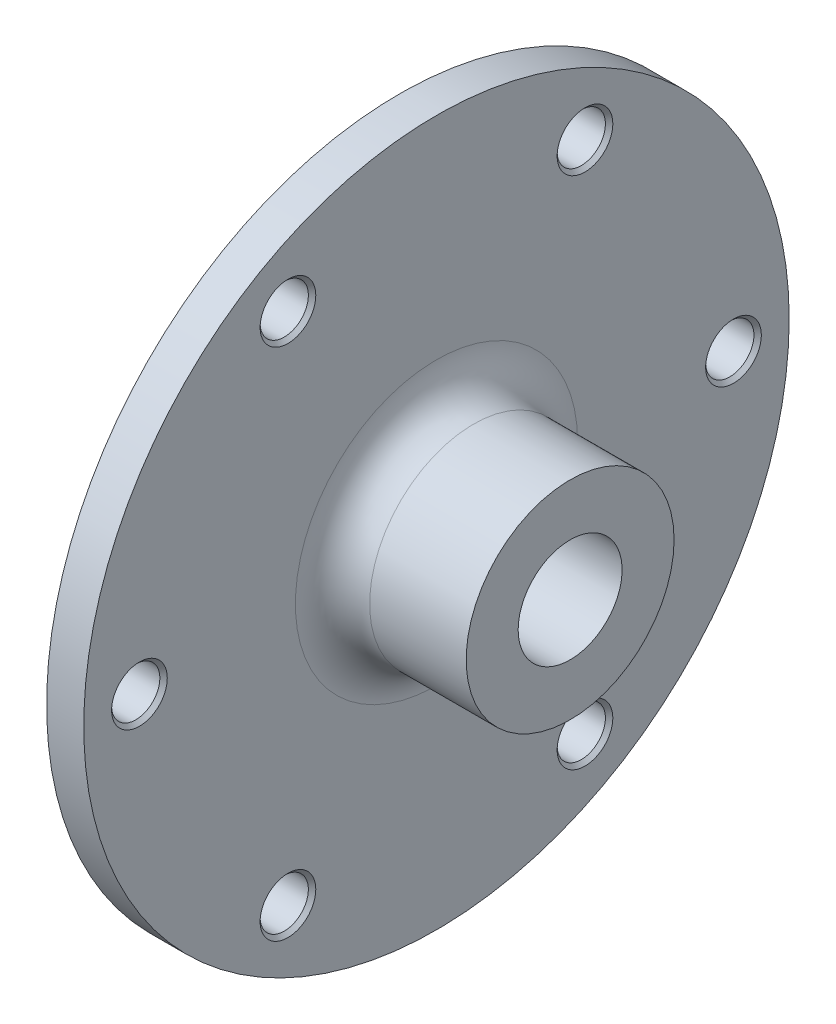
ISO-10303-21;
HEADER;
FILE_DESCRIPTION(('STEP AP214'),'2;1');
FILE_NAME('part.step','',(''),(''),'','','');
FILE_SCHEMA(('AUTOMOTIVE_DESIGN { 1 0 10303 214 1 1 1 1 }'));
ENDSEC;
DATA;
#1=APPLICATION_CONTEXT('core data for automotive mechanical design processes');
#2=APPLICATION_PROTOCOL_DEFINITION('international standard','automotive_design',2000,#1);
#3=PRODUCT_CONTEXT('',#1,'mechanical');
#4=PRODUCT('Part','Part','',(#3));
#5=PRODUCT_RELATED_PRODUCT_CATEGORY('part','',(#4));
#6=PRODUCT_DEFINITION_FORMATION('','',#4);
#7=PRODUCT_DEFINITION_CONTEXT('part definition',#1,'design');
#8=PRODUCT_DEFINITION('design','',#6,#7);
#9=PRODUCT_DEFINITION_SHAPE('','',#8);
#10=(LENGTH_UNIT() NAMED_UNIT(*) SI_UNIT(.MILLI.,.METRE.));
#11=(NAMED_UNIT(*) PLANE_ANGLE_UNIT() SI_UNIT($,.RADIAN.));
#12=(NAMED_UNIT(*) SI_UNIT($,.STERADIAN.) SOLID_ANGLE_UNIT());
#13=UNCERTAINTY_MEASURE_WITH_UNIT(LENGTH_MEASURE(1.E-05),#10,'distance_accuracy_value','');
#14=(GEOMETRIC_REPRESENTATION_CONTEXT(3) GLOBAL_UNCERTAINTY_ASSIGNED_CONTEXT((#13)) GLOBAL_UNIT_ASSIGNED_CONTEXT((#10,
#11,#12)) REPRESENTATION_CONTEXT('',''));
#15=CARTESIAN_POINT('',(0.,0.,0.));
#16=DIRECTION('',(0.,0.,1.));
#17=DIRECTION('',(1.,0.,0.));
#18=AXIS2_PLACEMENT_3D('',#15,#16,#17);
#19=CARTESIAN_POINT('',(0.,14.,0.));
#20=DIRECTION('',(1.,0.,0.));
#21=DIRECTION('',(0.,0.,-1.));
#22=AXIS2_PLACEMENT_3D('',#19,#20,#21);
#23=PLANE('',#22);
#24=CARTESIAN_POINT('',(0.,0.,0.));
#25=DIRECTION('',(-1.,0.,0.));
#26=DIRECTION('',(0.,0.,1.));
#27=AXIS2_PLACEMENT_3D('',#24,#25,#26);
#28=CIRCLE('',#27,6.99999999999999);
#29=CARTESIAN_POINT('',(0.,0.,6.99999999999999));
#30=VERTEX_POINT('',#29);
#31=EDGE_CURVE('E103',#30,#30,#28,.T.);
#32=ORIENTED_EDGE('',*,*,#31,.T.);
#33=EDGE_LOOP('',(#32));
#34=FACE_BOUND('',#33,.T.);
#35=CARTESIAN_POINT('',(0.,0.,0.));
#36=DIRECTION('',(1.,0.,0.));
#37=DIRECTION('',(0.,0.,-1.));
#38=AXIS2_PLACEMENT_3D('',#35,#36,#37);
#39=CIRCLE('',#38,14.);
#40=CARTESIAN_POINT('',(0.,0.,-14.));
#41=VERTEX_POINT('',#40);
#42=EDGE_CURVE('E106',#41,#41,#39,.T.);
#43=ORIENTED_EDGE('',*,*,#42,.T.);
#44=EDGE_LOOP('',(#43));
#45=FACE_BOUND('',#44,.T.);
#46=ADVANCED_FACE('F31',(#34,#45),#23,.T.);
#47=CARTESIAN_POINT('',(-28.,0.,0.));
#48=DIRECTION('',(-1.,0.,0.));
#49=DIRECTION('',(0.,0.,1.));
#50=AXIS2_PLACEMENT_3D('',#47,#48,#49);
#51=PLANE('',#50);
#52=CARTESIAN_POINT('',(-28.,0.,0.));
#53=DIRECTION('',(-1.,0.,0.));
#54=DIRECTION('',(0.,0.,1.));
#55=AXIS2_PLACEMENT_3D('',#52,#53,#54);
#56=CIRCLE('',#55,13.);
#57=CARTESIAN_POINT('',(-28.,0.,13.));
#58=VERTEX_POINT('',#57);
#59=EDGE_CURVE('E51',#58,#58,#56,.T.);
#60=ORIENTED_EDGE('',*,*,#59,.F.);
#61=EDGE_LOOP('',(#60));
#62=FACE_BOUND('',#61,.T.);
#63=CARTESIAN_POINT('',(-28.,0.,0.));
#64=DIRECTION('',(1.,0.,0.));
#65=DIRECTION('',(0.,0.,-1.));
#66=AXIS2_PLACEMENT_3D('',#63,#64,#65);
#67=CIRCLE('',#66,35.);
#68=CARTESIAN_POINT('',(-28.,0.,-35.));
#69=VERTEX_POINT('',#68);
#70=EDGE_CURVE('E44',#69,#69,#67,.T.);
#71=ORIENTED_EDGE('',*,*,#70,.F.);
#72=EDGE_LOOP('',(#71));
#73=FACE_BOUND('',#72,.T.);
#74=ADVANCED_FACE('F123',(#62,#73),#51,.T.);
#75=CARTESIAN_POINT('',(0.,0.,0.));
#76=DIRECTION('',(1.,0.,0.));
#77=DIRECTION('',(0.,0.,-1.));
#78=AXIS2_PLACEMENT_3D('',#75,#76,#77);
#79=CYLINDRICAL_SURFACE('',#78,35.);
#80=ORIENTED_EDGE('',*,*,#70,.T.);
#81=EDGE_LOOP('',(#80));
#82=FACE_BOUND('',#81,.T.);
#83=CARTESIAN_POINT('',(-23.,0.,0.));
#84=DIRECTION('',(1.,0.,0.));
#85=DIRECTION('',(0.,0.,-1.));
#86=AXIS2_PLACEMENT_3D('',#83,#84,#85);
#87=CIRCLE('',#86,35.);
#88=CARTESIAN_POINT('',(-23.,0.,-35.));
#89=VERTEX_POINT('',#88);
#90=EDGE_CURVE('E115',#89,#89,#87,.T.);
#91=ORIENTED_EDGE('',*,*,#90,.F.);
#92=EDGE_LOOP('',(#91));
#93=FACE_BOUND('',#92,.T.);
#94=ADVANCED_FACE('F120',(#82,#93),#79,.T.);
#95=CARTESIAN_POINT('',(-23.,35.,0.));
#96=DIRECTION('',(-1.,0.,0.));
#97=DIRECTION('',(0.,0.,1.));
#98=AXIS2_PLACEMENT_3D('',#95,#96,#97);
#99=PLANE('',#98);
#100=CARTESIAN_POINT('',(-23.,-34.6410161513773,20.0000000000004));
#101=DIRECTION('',(-1.,0.,0.));
#102=DIRECTION('',(0.,0.,1.));
#103=AXIS2_PLACEMENT_3D('',#100,#101,#102);
#104=CIRCLE('',#103,3.25);
#105=CARTESIAN_POINT('',(-23.,-34.6410161513773,23.2500000000004));
#106=VERTEX_POINT('',#105);
#107=EDGE_CURVE('E35',#106,#106,#104,.T.);
#108=ORIENTED_EDGE('',*,*,#107,.F.);
#109=EDGE_LOOP('',(#108));
#110=FACE_BOUND('',#109,.T.);
#111=CARTESIAN_POINT('',(-23.,-34.6410161513777,-19.9999999999997));
#112=DIRECTION('',(-1.,0.,0.));
#113=DIRECTION('',(0.,0.,1.));
#114=AXIS2_PLACEMENT_3D('',#111,#112,#113);
#115=CIRCLE('',#114,3.25);
#116=CARTESIAN_POINT('',(-23.,-34.6410161513777,-16.7499999999997));
#117=VERTEX_POINT('',#116);
#118=EDGE_CURVE('E67',#117,#117,#115,.T.);
#119=ORIENTED_EDGE('',*,*,#118,.F.);
#120=EDGE_LOOP('',(#119));
#121=FACE_BOUND('',#120,.T.);
#122=CARTESIAN_POINT('',(-23.,0.,-40.));
#123=DIRECTION('',(-1.,0.,0.));
#124=DIRECTION('',(0.,0.,1.));
#125=AXIS2_PLACEMENT_3D('',#122,#123,#124);
#126=CIRCLE('',#125,3.25);
#127=CARTESIAN_POINT('',(-23.,0.,-36.75));
#128=VERTEX_POINT('',#127);
#129=EDGE_CURVE('E63',#128,#128,#126,.T.);
#130=ORIENTED_EDGE('',*,*,#129,.F.);
#131=EDGE_LOOP('',(#130));
#132=FACE_BOUND('',#131,.T.);
#133=CARTESIAN_POINT('',(-23.,34.6410161513775,-20.0000000000002));
#134=DIRECTION('',(-1.,0.,0.));
#135=DIRECTION('',(0.,0.,1.));
#136=AXIS2_PLACEMENT_3D('',#133,#134,#135);
#137=CIRCLE('',#136,3.25);
#138=CARTESIAN_POINT('',(-23.,34.6410161513775,-16.7500000000002));
#139=VERTEX_POINT('',#138);
#140=EDGE_CURVE('E58',#139,#139,#137,.T.);
#141=ORIENTED_EDGE('',*,*,#140,.F.);
#142=EDGE_LOOP('',(#141));
#143=FACE_BOUND('',#142,.T.);
#144=CARTESIAN_POINT('',(-23.,34.6410161513776,19.9999999999999));
#145=DIRECTION('',(-1.,0.,0.));
#146=DIRECTION('',(0.,0.,1.));
#147=AXIS2_PLACEMENT_3D('',#144,#145,#146);
#148=CIRCLE('',#147,3.25);
#149=CARTESIAN_POINT('',(-23.,34.6410161513776,23.2499999999999));
#150=VERTEX_POINT('',#149);
#151=EDGE_CURVE('E53',#150,#150,#148,.T.);
#152=ORIENTED_EDGE('',*,*,#151,.F.);
#153=EDGE_LOOP('',(#152));
#154=FACE_BOUND('',#153,.T.);
#155=CARTESIAN_POINT('',(-23.,0.,40.));
#156=DIRECTION('',(-1.,0.,0.));
#157=DIRECTION('',(0.,0.,1.));
#158=AXIS2_PLACEMENT_3D('',#155,#156,#157);
#159=CIRCLE('',#158,3.25);
#160=CARTESIAN_POINT('',(-23.,0.,43.25));
#161=VERTEX_POINT('',#160);
#162=EDGE_CURVE('E48',#161,#161,#159,.T.);
#163=ORIENTED_EDGE('',*,*,#162,.F.);
#164=EDGE_LOOP('',(#163));
#165=FACE_BOUND('',#164,.T.);
#166=ORIENTED_EDGE('',*,*,#90,.T.);
#167=EDGE_LOOP('',(#166));
#168=FACE_BOUND('',#167,.T.);
#169=CARTESIAN_POINT('',(-23.,0.,0.));
#170=DIRECTION('',(1.,0.,0.));
#171=DIRECTION('',(0.,0.,-1.));
#172=AXIS2_PLACEMENT_3D('',#169,#170,#171);
#173=CIRCLE('',#172,47.5);
#174=CARTESIAN_POINT('',(-23.,0.,-47.5));
#175=VERTEX_POINT('',#174);
#176=EDGE_CURVE('E112',#175,#175,#173,.T.);
#177=ORIENTED_EDGE('',*,*,#176,.F.);
#178=EDGE_LOOP('',(#177));
#179=FACE_BOUND('',#178,.T.);
#180=ADVANCED_FACE('F131',(#110,#121,#132,#143,#154,#165,#168,#179),#99,.T.);
#181=CARTESIAN_POINT('',(0.,0.,0.));
#182=DIRECTION('',(1.,0.,0.));
#183=DIRECTION('',(0.,0.,-1.));
#184=AXIS2_PLACEMENT_3D('',#181,#182,#183);
#185=CYLINDRICAL_SURFACE('',#184,47.5);
#186=ORIENTED_EDGE('',*,*,#176,.T.);
#187=EDGE_LOOP('',(#186));
#188=FACE_BOUND('',#187,.T.);
#189=CARTESIAN_POINT('',(-18.,0.,0.));
#190=DIRECTION('',(1.,0.,0.));
#191=DIRECTION('',(0.,0.,-1.));
#192=AXIS2_PLACEMENT_3D('',#189,#190,#191);
#193=CIRCLE('',#192,47.5);
#194=CARTESIAN_POINT('',(-18.,0.,-47.5));
#195=VERTEX_POINT('',#194);
#196=EDGE_CURVE('E109',#195,#195,#193,.T.);
#197=ORIENTED_EDGE('',*,*,#196,.F.);
#198=EDGE_LOOP('',(#197));
#199=FACE_BOUND('',#198,.T.);
#200=ADVANCED_FACE('F138',(#188,#199),#185,.T.);
#201=CARTESIAN_POINT('',(-18.,47.5,0.));
#202=DIRECTION('',(1.,0.,0.));
#203=DIRECTION('',(0.,0.,-1.));
#204=AXIS2_PLACEMENT_3D('',#201,#202,#203);
#205=PLANE('',#204);
#206=CARTESIAN_POINT('',(-18.,-34.6410161513773,20.0000000000004));
#207=DIRECTION('',(1.,0.,0.));
#208=DIRECTION('',(0.,0.,-1.));
#209=AXIS2_PLACEMENT_3D('',#206,#207,#208);
#210=CIRCLE('',#209,3.75);
#211=CARTESIAN_POINT('',(-18.,-34.6410161513773,16.2500000000004));
#212=VERTEX_POINT('',#211);
#213=EDGE_CURVE('E213',#212,#212,#210,.T.);
#214=ORIENTED_EDGE('',*,*,#213,.F.);
#215=EDGE_LOOP('',(#214));
#216=FACE_BOUND('',#215,.T.);
#217=CARTESIAN_POINT('',(-18.,-34.6410161513777,-19.9999999999997));
#218=DIRECTION('',(1.,0.,0.));
#219=DIRECTION('',(0.,0.,-1.));
#220=AXIS2_PLACEMENT_3D('',#217,#218,#219);
#221=CIRCLE('',#220,3.75);
#222=CARTESIAN_POINT('',(-18.,-34.6410161513777,-23.7499999999997));
#223=VERTEX_POINT('',#222);
#224=EDGE_CURVE('E76',#223,#223,#221,.T.);
#225=ORIENTED_EDGE('',*,*,#224,.F.);
#226=EDGE_LOOP('',(#225));
#227=FACE_BOUND('',#226,.T.);
#228=CARTESIAN_POINT('',(-18.,0.,-40.));
#229=DIRECTION('',(1.,0.,0.));
#230=DIRECTION('',(0.,0.,-1.));
#231=AXIS2_PLACEMENT_3D('',#228,#229,#230);
#232=CIRCLE('',#231,3.75);
#233=CARTESIAN_POINT('',(-18.,0.,-43.75));
#234=VERTEX_POINT('',#233);
#235=EDGE_CURVE('E69',#234,#234,#232,.T.);
#236=ORIENTED_EDGE('',*,*,#235,.F.);
#237=EDGE_LOOP('',(#236));
#238=FACE_BOUND('',#237,.T.);
#239=CARTESIAN_POINT('',(-18.,34.6410161513775,-20.0000000000002));
#240=DIRECTION('',(1.,0.,0.));
#241=DIRECTION('',(0.,0.,-1.));
#242=AXIS2_PLACEMENT_3D('',#239,#240,#241);
#243=CIRCLE('',#242,3.75);
#244=CARTESIAN_POINT('',(-18.,34.6410161513775,-23.7500000000002));
#245=VERTEX_POINT('',#244);
#246=EDGE_CURVE('E65',#245,#245,#243,.T.);
#247=ORIENTED_EDGE('',*,*,#246,.F.);
#248=EDGE_LOOP('',(#247));
#249=FACE_BOUND('',#248,.T.);
#250=CARTESIAN_POINT('',(-18.,34.6410161513776,19.9999999999999));
#251=DIRECTION('',(1.,0.,0.));
#252=DIRECTION('',(0.,0.,-1.));
#253=AXIS2_PLACEMENT_3D('',#250,#251,#252);
#254=CIRCLE('',#253,3.75);
#255=CARTESIAN_POINT('',(-18.,34.6410161513776,16.2499999999999));
#256=VERTEX_POINT('',#255);
#257=EDGE_CURVE('E61',#256,#256,#254,.T.);
#258=ORIENTED_EDGE('',*,*,#257,.F.);
#259=EDGE_LOOP('',(#258));
#260=FACE_BOUND('',#259,.T.);
#261=CARTESIAN_POINT('',(-18.,0.,40.));
#262=DIRECTION('',(1.,0.,0.));
#263=DIRECTION('',(0.,0.,-1.));
#264=AXIS2_PLACEMENT_3D('',#261,#262,#263);
#265=CIRCLE('',#264,3.75);
#266=CARTESIAN_POINT('',(-18.,0.,36.25));
#267=VERTEX_POINT('',#266);
#268=EDGE_CURVE('E56',#267,#267,#265,.T.);
#269=ORIENTED_EDGE('',*,*,#268,.F.);
#270=EDGE_LOOP('',(#269));
#271=FACE_BOUND('',#270,.T.);
#272=CARTESIAN_POINT('',(-18.,0.,0.));
#273=DIRECTION('',(1.,0.,0.));
#274=DIRECTION('',(0.,0.,-1.));
#275=AXIS2_PLACEMENT_3D('',#272,#273,#274);
#276=CIRCLE('',#275,19.);
#277=CARTESIAN_POINT('',(-18.,0.,-19.));
#278=VERTEX_POINT('',#277);
#279=EDGE_CURVE('E10',#278,#278,#276,.F.);
#280=ORIENTED_EDGE('',*,*,#279,.T.);
#281=EDGE_LOOP('',(#280));
#282=FACE_BOUND('',#281,.T.);
#283=ORIENTED_EDGE('',*,*,#196,.T.);
#284=EDGE_LOOP('',(#283));
#285=FACE_BOUND('',#284,.T.);
#286=ADVANCED_FACE('F142',(#216,#227,#238,#249,#260,#271,#282,#285),#205,.T.);
#287=CARTESIAN_POINT('',(0.,0.,0.));
#288=DIRECTION('',(1.,0.,0.));
#289=DIRECTION('',(0.,0.,-1.));
#290=AXIS2_PLACEMENT_3D('',#287,#288,#289);
#291=CYLINDRICAL_SURFACE('',#290,14.);
#292=CARTESIAN_POINT('',(-13.,0.,0.));
#293=DIRECTION('',(1.,0.,0.));
#294=DIRECTION('',(0.,0.,-1.));
#295=AXIS2_PLACEMENT_3D('',#292,#293,#294);
#296=CIRCLE('',#295,14.);
#297=CARTESIAN_POINT('',(-13.,0.,-14.));
#298=VERTEX_POINT('',#297);
#299=EDGE_CURVE('E39',#298,#298,#296,.T.);
#300=ORIENTED_EDGE('',*,*,#299,.T.);
#301=EDGE_LOOP('',(#300));
#302=FACE_BOUND('',#301,.T.);
#303=ORIENTED_EDGE('',*,*,#42,.F.);
#304=EDGE_LOOP('',(#303));
#305=FACE_BOUND('',#304,.T.);
#306=ADVANCED_FACE('F146',(#302,#305),#291,.T.);
#307=CARTESIAN_POINT('',(-13.,0.,0.));
#308=DIRECTION('',(1.,0.,0.));
#309=DIRECTION('',(0.,0.,-1.));
#310=AXIS2_PLACEMENT_3D('',#307,#308,#309);
#311=TOROIDAL_SURFACE('',#310,19.,5.);
#312=ORIENTED_EDGE('',*,*,#279,.F.);
#313=EDGE_LOOP('',(#312));
#314=FACE_BOUND('',#313,.T.);
#315=ORIENTED_EDGE('',*,*,#299,.F.);
#316=EDGE_LOOP('',(#315));
#317=FACE_BOUND('',#316,.T.);
#318=ADVANCED_FACE('F33',(#314,#317),#311,.F.);
#319=CARTESIAN_POINT('',(-28.,0.,0.));
#320=DIRECTION('',(-1.,0.,0.));
#321=DIRECTION('',(0.,0.,1.));
#322=AXIS2_PLACEMENT_3D('',#319,#320,#321);
#323=CYLINDRICAL_SURFACE('',#322,6.99999999999999);
#324=ORIENTED_EDGE('',*,*,#31,.F.);
#325=EDGE_LOOP('',(#324));
#326=FACE_BOUND('',#325,.T.);
#327=CARTESIAN_POINT('',(-22.,0.,0.));
#328=DIRECTION('',(-1.,0.,0.));
#329=DIRECTION('',(0.,0.,1.));
#330=AXIS2_PLACEMENT_3D('',#327,#328,#329);
#331=CIRCLE('',#330,7.);
#332=CARTESIAN_POINT('',(-22.,0.,7.));
#333=VERTEX_POINT('',#332);
#334=EDGE_CURVE('E100',#333,#333,#331,.T.);
#335=ORIENTED_EDGE('',*,*,#334,.T.);
#336=EDGE_LOOP('',(#335));
#337=FACE_BOUND('',#336,.T.);
#338=ADVANCED_FACE('F151',(#326,#337),#323,.F.);
#339=CARTESIAN_POINT('',(-28.,0.,0.));
#340=DIRECTION('',(-1.,0.,0.));
#341=DIRECTION('',(0.,0.,1.));
#342=AXIS2_PLACEMENT_3D('',#339,#340,#341);
#343=CONICAL_SURFACE('',#342,13.,0.785398163397449);
#344=ORIENTED_EDGE('',*,*,#334,.F.);
#345=EDGE_LOOP('',(#344));
#346=FACE_BOUND('',#345,.T.);
#347=ORIENTED_EDGE('',*,*,#59,.T.);
#348=EDGE_LOOP('',(#347));
#349=FACE_BOUND('',#348,.T.);
#350=ADVANCED_FACE('F154',(#346,#349),#343,.F.);
#351=CARTESIAN_POINT('',(-18.,0.,40.));
#352=DIRECTION('',(1.,0.,0.));
#353=DIRECTION('',(0.,0.,-1.));
#354=AXIS2_PLACEMENT_3D('',#351,#352,#353);
#355=CYLINDRICAL_SURFACE('',#354,3.25);
#356=ORIENTED_EDGE('',*,*,#162,.T.);
#357=EDGE_LOOP('',(#356));
#358=FACE_BOUND('',#357,.T.);
#359=CARTESIAN_POINT('',(-18.5,0.,40.));
#360=DIRECTION('',(1.,0.,0.));
#361=DIRECTION('',(0.,0.,-1.));
#362=AXIS2_PLACEMENT_3D('',#359,#360,#361);
#363=CIRCLE('',#362,3.25);
#364=CARTESIAN_POINT('',(-18.5,0.,36.75));
#365=VERTEX_POINT('',#364);
#366=EDGE_CURVE('E52',#365,#365,#363,.T.);
#367=ORIENTED_EDGE('',*,*,#366,.T.);
#368=EDGE_LOOP('',(#367));
#369=FACE_BOUND('',#368,.T.);
#370=ADVANCED_FACE('F158',(#358,#369),#355,.F.);
#371=CARTESIAN_POINT('',(-18.,0.,40.));
#372=DIRECTION('',(1.,0.,0.));
#373=DIRECTION('',(0.,0.,-1.));
#374=AXIS2_PLACEMENT_3D('',#371,#372,#373);
#375=CONICAL_SURFACE('',#374,3.75,0.785398163397447);
#376=ORIENTED_EDGE('',*,*,#366,.F.);
#377=EDGE_LOOP('',(#376));
#378=FACE_BOUND('',#377,.T.);
#379=ORIENTED_EDGE('',*,*,#268,.T.);
#380=EDGE_LOOP('',(#379));
#381=FACE_BOUND('',#380,.T.);
#382=ADVANCED_FACE('F162',(#378,#381),#375,.F.);
#383=CARTESIAN_POINT('',(-18.,34.6410161513776,19.9999999999999));
#384=DIRECTION('',(1.,0.,0.));
#385=DIRECTION('',(0.,0.,-1.));
#386=AXIS2_PLACEMENT_3D('',#383,#384,#385);
#387=CYLINDRICAL_SURFACE('',#386,3.25);
#388=ORIENTED_EDGE('',*,*,#151,.T.);
#389=EDGE_LOOP('',(#388));
#390=FACE_BOUND('',#389,.T.);
#391=CARTESIAN_POINT('',(-18.5,34.6410161513776,19.9999999999999));
#392=DIRECTION('',(1.,0.,0.));
#393=DIRECTION('',(0.,0.,-1.));
#394=AXIS2_PLACEMENT_3D('',#391,#392,#393);
#395=CIRCLE('',#394,3.25);
#396=CARTESIAN_POINT('',(-18.5,34.6410161513776,16.7499999999999));
#397=VERTEX_POINT('',#396);
#398=EDGE_CURVE('E57',#397,#397,#395,.T.);
#399=ORIENTED_EDGE('',*,*,#398,.T.);
#400=EDGE_LOOP('',(#399));
#401=FACE_BOUND('',#400,.T.);
#402=ADVANCED_FACE('F166',(#390,#401),#387,.F.);
#403=CARTESIAN_POINT('',(-18.,34.6410161513776,19.9999999999999));
#404=DIRECTION('',(1.,0.,0.));
#405=DIRECTION('',(0.,0.,-1.));
#406=AXIS2_PLACEMENT_3D('',#403,#404,#405);
#407=CONICAL_SURFACE('',#406,3.75,0.785398163397445);
#408=ORIENTED_EDGE('',*,*,#398,.F.);
#409=EDGE_LOOP('',(#408));
#410=FACE_BOUND('',#409,.T.);
#411=ORIENTED_EDGE('',*,*,#257,.T.);
#412=EDGE_LOOP('',(#411));
#413=FACE_BOUND('',#412,.T.);
#414=ADVANCED_FACE('F170',(#410,#413),#407,.F.);
#415=CARTESIAN_POINT('',(-18.,34.6410161513775,-20.0000000000002));
#416=DIRECTION('',(1.,0.,0.));
#417=DIRECTION('',(0.,0.,-1.));
#418=AXIS2_PLACEMENT_3D('',#415,#416,#417);
#419=CYLINDRICAL_SURFACE('',#418,3.25);
#420=ORIENTED_EDGE('',*,*,#140,.T.);
#421=EDGE_LOOP('',(#420));
#422=FACE_BOUND('',#421,.T.);
#423=CARTESIAN_POINT('',(-18.5,34.6410161513775,-20.0000000000002));
#424=DIRECTION('',(1.,0.,0.));
#425=DIRECTION('',(0.,0.,-1.));
#426=AXIS2_PLACEMENT_3D('',#423,#424,#425);
#427=CIRCLE('',#426,3.25);
#428=CARTESIAN_POINT('',(-18.5,34.6410161513775,-23.2500000000002));
#429=VERTEX_POINT('',#428);
#430=EDGE_CURVE('E62',#429,#429,#427,.T.);
#431=ORIENTED_EDGE('',*,*,#430,.T.);
#432=EDGE_LOOP('',(#431));
#433=FACE_BOUND('',#432,.T.);
#434=ADVANCED_FACE('F174',(#422,#433),#419,.F.);
#435=CARTESIAN_POINT('',(-18.,34.6410161513775,-20.0000000000002));
#436=DIRECTION('',(1.,0.,0.));
#437=DIRECTION('',(0.,0.,-1.));
#438=AXIS2_PLACEMENT_3D('',#435,#436,#437);
#439=CONICAL_SURFACE('',#438,3.75,0.785398163397452);
#440=ORIENTED_EDGE('',*,*,#430,.F.);
#441=EDGE_LOOP('',(#440));
#442=FACE_BOUND('',#441,.T.);
#443=ORIENTED_EDGE('',*,*,#246,.T.);
#444=EDGE_LOOP('',(#443));
#445=FACE_BOUND('',#444,.T.);
#446=ADVANCED_FACE('F178',(#442,#445),#439,.F.);
#447=CARTESIAN_POINT('',(-18.,0.,-40.));
#448=DIRECTION('',(1.,0.,0.));
#449=DIRECTION('',(0.,0.,-1.));
#450=AXIS2_PLACEMENT_3D('',#447,#448,#449);
#451=CYLINDRICAL_SURFACE('',#450,3.25);
#452=ORIENTED_EDGE('',*,*,#129,.T.);
#453=EDGE_LOOP('',(#452));
#454=FACE_BOUND('',#453,.T.);
#455=CARTESIAN_POINT('',(-18.5,0.,-40.));
#456=DIRECTION('',(1.,0.,0.));
#457=DIRECTION('',(0.,0.,-1.));
#458=AXIS2_PLACEMENT_3D('',#455,#456,#457);
#459=CIRCLE('',#458,3.25);
#460=CARTESIAN_POINT('',(-18.5,0.,-43.25));
#461=VERTEX_POINT('',#460);
#462=EDGE_CURVE('E66',#461,#461,#459,.T.);
#463=ORIENTED_EDGE('',*,*,#462,.T.);
#464=EDGE_LOOP('',(#463));
#465=FACE_BOUND('',#464,.T.);
#466=ADVANCED_FACE('F182',(#454,#465),#451,.F.);
#467=CARTESIAN_POINT('',(-18.,0.,-40.));
#468=DIRECTION('',(1.,0.,0.));
#469=DIRECTION('',(0.,0.,-1.));
#470=AXIS2_PLACEMENT_3D('',#467,#468,#469);
#471=CONICAL_SURFACE('',#470,3.75,0.785398163397447);
#472=ORIENTED_EDGE('',*,*,#462,.F.);
#473=EDGE_LOOP('',(#472));
#474=FACE_BOUND('',#473,.T.);
#475=ORIENTED_EDGE('',*,*,#235,.T.);
#476=EDGE_LOOP('',(#475));
#477=FACE_BOUND('',#476,.T.);
#478=ADVANCED_FACE('F186',(#474,#477),#471,.F.);
#479=CARTESIAN_POINT('',(-18.,-34.6410161513777,-19.9999999999997));
#480=DIRECTION('',(1.,0.,0.));
#481=DIRECTION('',(0.,0.,-1.));
#482=AXIS2_PLACEMENT_3D('',#479,#480,#481);
#483=CYLINDRICAL_SURFACE('',#482,3.25);
#484=ORIENTED_EDGE('',*,*,#118,.T.);
#485=EDGE_LOOP('',(#484));
#486=FACE_BOUND('',#485,.T.);
#487=CARTESIAN_POINT('',(-18.5,-34.6410161513777,-19.9999999999997));
#488=DIRECTION('',(1.,0.,0.));
#489=DIRECTION('',(0.,0.,-1.));
#490=AXIS2_PLACEMENT_3D('',#487,#488,#489);
#491=CIRCLE('',#490,3.25);
#492=CARTESIAN_POINT('',(-18.5,-34.6410161513777,-23.2499999999997));
#493=VERTEX_POINT('',#492);
#494=EDGE_CURVE('E70',#493,#493,#491,.T.);
#495=ORIENTED_EDGE('',*,*,#494,.T.);
#496=EDGE_LOOP('',(#495));
#497=FACE_BOUND('',#496,.T.);
#498=ADVANCED_FACE('F190',(#486,#497),#483,.F.);
#499=CARTESIAN_POINT('',(-18.,-34.6410161513777,-19.9999999999997));
#500=DIRECTION('',(1.,0.,0.));
#501=DIRECTION('',(0.,0.,-1.));
#502=AXIS2_PLACEMENT_3D('',#499,#500,#501);
#503=CONICAL_SURFACE('',#502,3.75,0.785398163397448);
#504=ORIENTED_EDGE('',*,*,#494,.F.);
#505=EDGE_LOOP('',(#504));
#506=FACE_BOUND('',#505,.T.);
#507=ORIENTED_EDGE('',*,*,#224,.T.);
#508=EDGE_LOOP('',(#507));
#509=FACE_BOUND('',#508,.T.);
#510=ADVANCED_FACE('F194',(#506,#509),#503,.F.);
#511=CARTESIAN_POINT('',(-18.,-34.6410161513773,20.0000000000004));
#512=DIRECTION('',(1.,0.,0.));
#513=DIRECTION('',(0.,0.,-1.));
#514=AXIS2_PLACEMENT_3D('',#511,#512,#513);
#515=CYLINDRICAL_SURFACE('',#514,3.25);
#516=ORIENTED_EDGE('',*,*,#107,.T.);
#517=EDGE_LOOP('',(#516));
#518=FACE_BOUND('',#517,.T.);
#519=CARTESIAN_POINT('',(-18.5,-34.6410161513773,20.0000000000004));
#520=DIRECTION('',(1.,0.,0.));
#521=DIRECTION('',(0.,0.,-1.));
#522=AXIS2_PLACEMENT_3D('',#519,#520,#521);
#523=CIRCLE('',#522,3.25);
#524=CARTESIAN_POINT('',(-18.5,-34.6410161513773,16.7500000000004));
#525=VERTEX_POINT('',#524);
#526=EDGE_CURVE('E210',#525,#525,#523,.T.);
#527=ORIENTED_EDGE('',*,*,#526,.T.);
#528=EDGE_LOOP('',(#527));
#529=FACE_BOUND('',#528,.T.);
#530=ADVANCED_FACE('F197',(#518,#529),#515,.F.);
#531=CARTESIAN_POINT('',(-18.,-34.6410161513773,20.0000000000004));
#532=DIRECTION('',(1.,0.,0.));
#533=DIRECTION('',(0.,0.,-1.));
#534=AXIS2_PLACEMENT_3D('',#531,#532,#533);
#535=CONICAL_SURFACE('',#534,3.75,0.785398163397448);
#536=ORIENTED_EDGE('',*,*,#526,.F.);
#537=EDGE_LOOP('',(#536));
#538=FACE_BOUND('',#537,.T.);
#539=ORIENTED_EDGE('',*,*,#213,.T.);
#540=EDGE_LOOP('',(#539));
#541=FACE_BOUND('',#540,.T.);
#542=ADVANCED_FACE('F201',(#538,#541),#535,.F.);
#543=CLOSED_SHELL('',(#46,#74,#94,#180,#200,#286,#306,#318,#338,#350,#370,#382,#402,#414,#434,
#446,#466,#478,#498,#510,#530,#542));
#544=MANIFOLD_SOLID_BREP('B2',#543);
#545=ADVANCED_BREP_SHAPE_REPRESENTATION('',(#18,#544),#14);
#546=SHAPE_DEFINITION_REPRESENTATION(#9,#545);
ENDSEC;
END-ISO-10303-21;
